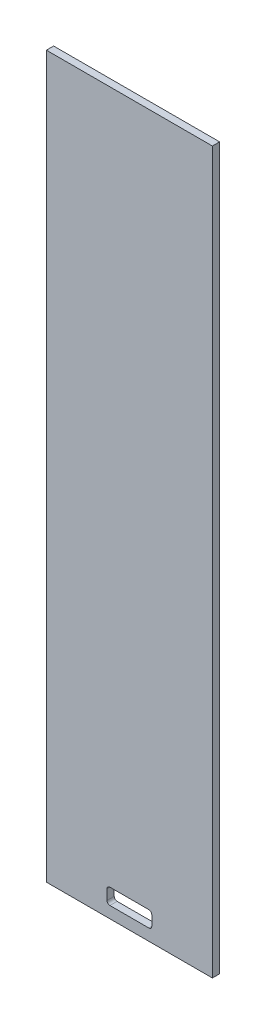
ISO-10303-21;
HEADER;
FILE_DESCRIPTION(('STEP AP214'),'2;1');
FILE_NAME('part.step','',(''),(''),'','','');
FILE_SCHEMA(('AUTOMOTIVE_DESIGN { 1 0 10303 214 1 1 1 1 }'));
ENDSEC;
DATA;
#1=APPLICATION_CONTEXT('core data for automotive mechanical design processes');
#2=APPLICATION_PROTOCOL_DEFINITION('international standard','automotive_design',2000,#1);
#3=PRODUCT_CONTEXT('',#1,'mechanical');
#4=PRODUCT('Part','Part','',(#3));
#5=PRODUCT_RELATED_PRODUCT_CATEGORY('part','',(#4));
#6=PRODUCT_DEFINITION_FORMATION('','',#4);
#7=PRODUCT_DEFINITION_CONTEXT('part definition',#1,'design');
#8=PRODUCT_DEFINITION('design','',#6,#7);
#9=PRODUCT_DEFINITION_SHAPE('','',#8);
#10=(LENGTH_UNIT() NAMED_UNIT(*) SI_UNIT(.MILLI.,.METRE.));
#11=(NAMED_UNIT(*) PLANE_ANGLE_UNIT() SI_UNIT($,.RADIAN.));
#12=(NAMED_UNIT(*) SI_UNIT($,.STERADIAN.) SOLID_ANGLE_UNIT());
#13=UNCERTAINTY_MEASURE_WITH_UNIT(LENGTH_MEASURE(1.E-05),#10,'distance_accuracy_value','');
#14=(GEOMETRIC_REPRESENTATION_CONTEXT(3) GLOBAL_UNCERTAINTY_ASSIGNED_CONTEXT((#13)) GLOBAL_UNIT_ASSIGNED_CONTEXT((#10,
#11,#12)) REPRESENTATION_CONTEXT('',''));
#15=CARTESIAN_POINT('',(0.,0.,0.));
#16=DIRECTION('',(0.,0.,1.));
#17=DIRECTION('',(1.,0.,0.));
#18=AXIS2_PLACEMENT_3D('',#15,#16,#17);
#19=CARTESIAN_POINT('',(-57.5,499.2,5.));
#20=DIRECTION('',(1.,0.,0.));
#21=DIRECTION('',(0.,1.,0.));
#22=AXIS2_PLACEMENT_3D('',#19,#20,#21);
#23=PLANE('',#22);
#24=DIRECTION('',(0.,-1.,0.));
#25=VECTOR('',#24,1.);
#26=CARTESIAN_POINT('',(-57.5,499.2,0.));
#27=LINE('',#26,#25);
#28=CARTESIAN_POINT('',(-57.5,499.2,0.));
#29=VERTEX_POINT('',#28);
#30=CARTESIAN_POINT('',(-57.5000000000001,0.,0.));
#31=VERTEX_POINT('',#30);
#32=EDGE_CURVE('E153',#29,#31,#27,.T.);
#33=ORIENTED_EDGE('',*,*,#32,.T.);
#34=DIRECTION('',(0.,0.,-1.));
#35=VECTOR('',#34,1.);
#36=CARTESIAN_POINT('',(-57.5000000000001,0.,5.));
#37=LINE('',#36,#35);
#38=CARTESIAN_POINT('',(-57.5000000000001,0.,5.));
#39=VERTEX_POINT('',#38);
#40=EDGE_CURVE('E132',#39,#31,#37,.T.);
#41=ORIENTED_EDGE('',*,*,#40,.F.);
#42=DIRECTION('',(0.,-1.,0.));
#43=VECTOR('',#42,1.);
#44=CARTESIAN_POINT('',(-57.5,499.2,5.));
#45=LINE('',#44,#43);
#46=CARTESIAN_POINT('',(-57.5,499.2,5.));
#47=VERTEX_POINT('',#46);
#48=EDGE_CURVE('E140',#47,#39,#45,.T.);
#49=ORIENTED_EDGE('',*,*,#48,.F.);
#50=DIRECTION('',(0.,0.,-1.));
#51=VECTOR('',#50,1.);
#52=CARTESIAN_POINT('',(-57.5,499.2,5.));
#53=LINE('',#52,#51);
#54=EDGE_CURVE('E253',#47,#29,#53,.T.);
#55=ORIENTED_EDGE('',*,*,#54,.T.);
#56=EDGE_LOOP('',(#33,#41,#49,#55));
#57=FACE_BOUND('',#56,.T.);
#58=ADVANCED_FACE('F38',(#57),#23,.F.);
#59=CARTESIAN_POINT('',(-57.5000000000001,0.,5.));
#60=DIRECTION('',(0.,1.,0.));
#61=DIRECTION('',(0.,0.,1.));
#62=AXIS2_PLACEMENT_3D('',#59,#60,#61);
#63=PLANE('',#62);
#64=DIRECTION('',(1.,0.,0.));
#65=VECTOR('',#64,1.);
#66=CARTESIAN_POINT('',(-57.5000000000001,0.,0.));
#67=LINE('',#66,#65);
#68=CARTESIAN_POINT('',(57.5000000000001,0.,0.));
#69=VERTEX_POINT('',#68);
#70=EDGE_CURVE('E256',#31,#69,#67,.T.);
#71=ORIENTED_EDGE('',*,*,#70,.T.);
#72=DIRECTION('',(0.,0.,-1.));
#73=VECTOR('',#72,1.);
#74=CARTESIAN_POINT('',(57.5000000000001,0.,5.));
#75=LINE('',#74,#73);
#76=CARTESIAN_POINT('',(57.5000000000001,0.,5.));
#77=VERTEX_POINT('',#76);
#78=EDGE_CURVE('E135',#77,#69,#75,.T.);
#79=ORIENTED_EDGE('',*,*,#78,.F.);
#80=DIRECTION('',(1.,0.,0.));
#81=VECTOR('',#80,1.);
#82=CARTESIAN_POINT('',(-57.5000000000001,0.,5.));
#83=LINE('',#82,#81);
#84=EDGE_CURVE('E128',#39,#77,#83,.T.);
#85=ORIENTED_EDGE('',*,*,#84,.F.);
#86=ORIENTED_EDGE('',*,*,#40,.T.);
#87=EDGE_LOOP('',(#71,#79,#85,#86));
#88=FACE_BOUND('',#87,.T.);
#89=ADVANCED_FACE('F130',(#88),#63,.F.);
#90=CARTESIAN_POINT('',(57.5,499.2,5.));
#91=DIRECTION('',(-1.,0.,0.));
#92=DIRECTION('',(0.,-1.,0.));
#93=AXIS2_PLACEMENT_3D('',#90,#91,#92);
#94=PLANE('',#93);
#95=DIRECTION('',(0.,1.,0.));
#96=VECTOR('',#95,1.);
#97=CARTESIAN_POINT('',(57.5,499.2,0.));
#98=LINE('',#97,#96);
#99=CARTESIAN_POINT('',(57.5,499.2,0.));
#100=VERTEX_POINT('',#99);
#101=EDGE_CURVE('E259',#69,#100,#98,.T.);
#102=ORIENTED_EDGE('',*,*,#101,.T.);
#103=DIRECTION('',(0.,0.,-1.));
#104=VECTOR('',#103,1.);
#105=CARTESIAN_POINT('',(57.5,499.2,5.));
#106=LINE('',#105,#104);
#107=CARTESIAN_POINT('',(57.5,499.2,5.));
#108=VERTEX_POINT('',#107);
#109=EDGE_CURVE('E161',#108,#100,#106,.T.);
#110=ORIENTED_EDGE('',*,*,#109,.F.);
#111=DIRECTION('',(0.,1.,0.));
#112=VECTOR('',#111,1.);
#113=CARTESIAN_POINT('',(57.5,499.2,5.));
#114=LINE('',#113,#112);
#115=EDGE_CURVE('E139',#77,#108,#114,.T.);
#116=ORIENTED_EDGE('',*,*,#115,.F.);
#117=ORIENTED_EDGE('',*,*,#78,.T.);
#118=EDGE_LOOP('',(#102,#110,#116,#117));
#119=FACE_BOUND('',#118,.T.);
#120=ADVANCED_FACE('F273',(#119),#94,.F.);
#121=CARTESIAN_POINT('',(-57.5,499.2,5.));
#122=DIRECTION('',(0.,-1.,0.));
#123=DIRECTION('',(0.,0.,-1.));
#124=AXIS2_PLACEMENT_3D('',#121,#122,#123);
#125=PLANE('',#124);
#126=DIRECTION('',(-1.,0.,0.));
#127=VECTOR('',#126,1.);
#128=CARTESIAN_POINT('',(-57.5,499.2,0.));
#129=LINE('',#128,#127);
#130=EDGE_CURVE('E150',#100,#29,#129,.T.);
#131=ORIENTED_EDGE('',*,*,#130,.T.);
#132=ORIENTED_EDGE('',*,*,#54,.F.);
#133=DIRECTION('',(-1.,0.,0.));
#134=VECTOR('',#133,1.);
#135=CARTESIAN_POINT('',(-57.5,499.2,5.));
#136=LINE('',#135,#134);
#137=EDGE_CURVE('E145',#108,#47,#136,.T.);
#138=ORIENTED_EDGE('',*,*,#137,.F.);
#139=ORIENTED_EDGE('',*,*,#109,.T.);
#140=EDGE_LOOP('',(#131,#132,#138,#139));
#141=FACE_BOUND('',#140,.T.);
#142=ADVANCED_FACE('F270',(#141),#125,.F.);
#143=CARTESIAN_POINT('',(0.,0.,5.));
#144=DIRECTION('',(0.,0.,1.));
#145=DIRECTION('',(1.,0.,0.));
#146=AXIS2_PLACEMENT_3D('',#143,#144,#145);
#147=PLANE('',#146);
#148=DIRECTION('',(0.,-1.,0.));
#149=VECTOR('',#148,1.);
#150=CARTESIAN_POINT('',(-15.5,19.,5.));
#151=LINE('',#150,#149);
#152=CARTESIAN_POINT('',(-15.5,17.,5.));
#153=VERTEX_POINT('',#152);
#154=CARTESIAN_POINT('',(-15.5,10.,5.));
#155=VERTEX_POINT('',#154);
#156=EDGE_CURVE('E208',#153,#155,#151,.T.);
#157=ORIENTED_EDGE('',*,*,#156,.F.);
#158=CARTESIAN_POINT('',(-13.5,17.,5.));
#159=DIRECTION('',(0.,0.,1.));
#160=DIRECTION('',(1.,0.,0.));
#161=AXIS2_PLACEMENT_3D('',#158,#159,#160);
#162=CIRCLE('',#161,2.);
#163=CARTESIAN_POINT('',(-13.5,19.,5.));
#164=VERTEX_POINT('',#163);
#165=EDGE_CURVE('E47',#153,#164,#162,.F.);
#166=ORIENTED_EDGE('',*,*,#165,.T.);
#167=DIRECTION('',(-1.,0.,0.));
#168=VECTOR('',#167,1.);
#169=CARTESIAN_POINT('',(-15.5,19.,5.));
#170=LINE('',#169,#168);
#171=CARTESIAN_POINT('',(13.5,19.,5.));
#172=VERTEX_POINT('',#171);
#173=EDGE_CURVE('E207',#172,#164,#170,.T.);
#174=ORIENTED_EDGE('',*,*,#173,.F.);
#175=CARTESIAN_POINT('',(13.5,17.,5.));
#176=DIRECTION('',(0.,0.,1.));
#177=DIRECTION('',(1.,0.,0.));
#178=AXIS2_PLACEMENT_3D('',#175,#176,#177);
#179=CIRCLE('',#178,2.);
#180=CARTESIAN_POINT('',(15.5,17.,5.));
#181=VERTEX_POINT('',#180);
#182=EDGE_CURVE('E194',#172,#181,#179,.F.);
#183=ORIENTED_EDGE('',*,*,#182,.T.);
#184=DIRECTION('',(0.,1.,0.));
#185=VECTOR('',#184,1.);
#186=CARTESIAN_POINT('',(15.5,19.,5.));
#187=LINE('',#186,#185);
#188=CARTESIAN_POINT('',(15.5,10.,5.));
#189=VERTEX_POINT('',#188);
#190=EDGE_CURVE('E216',#189,#181,#187,.T.);
#191=ORIENTED_EDGE('',*,*,#190,.F.);
#192=CARTESIAN_POINT('',(13.5,10.,5.));
#193=DIRECTION('',(0.,0.,1.));
#194=DIRECTION('',(1.,0.,0.));
#195=AXIS2_PLACEMENT_3D('',#192,#193,#194);
#196=CIRCLE('',#195,2.);
#197=CARTESIAN_POINT('',(13.5,8.,5.));
#198=VERTEX_POINT('',#197);
#199=EDGE_CURVE('E188',#189,#198,#196,.F.);
#200=ORIENTED_EDGE('',*,*,#199,.T.);
#201=DIRECTION('',(1.,0.,0.));
#202=VECTOR('',#201,1.);
#203=CARTESIAN_POINT('',(-15.5,8.,5.));
#204=LINE('',#203,#202);
#205=CARTESIAN_POINT('',(-13.5,8.,5.));
#206=VERTEX_POINT('',#205);
#207=EDGE_CURVE('E234',#206,#198,#204,.T.);
#208=ORIENTED_EDGE('',*,*,#207,.F.);
#209=CARTESIAN_POINT('',(-13.5,10.,5.));
#210=DIRECTION('',(0.,0.,1.));
#211=DIRECTION('',(1.,0.,0.));
#212=AXIS2_PLACEMENT_3D('',#209,#210,#211);
#213=CIRCLE('',#212,2.);
#214=EDGE_CURVE('E54',#206,#155,#213,.F.);
#215=ORIENTED_EDGE('',*,*,#214,.T.);
#216=EDGE_LOOP('',(#157,#166,#174,#183,#191,#200,#208,#215));
#217=FACE_BOUND('',#216,.T.);
#218=ORIENTED_EDGE('',*,*,#48,.T.);
#219=ORIENTED_EDGE('',*,*,#84,.T.);
#220=ORIENTED_EDGE('',*,*,#115,.T.);
#221=ORIENTED_EDGE('',*,*,#137,.T.);
#222=EDGE_LOOP('',(#218,#219,#220,#221));
#223=FACE_BOUND('',#222,.T.);
#224=ADVANCED_FACE('F143',(#217,#223),#147,.T.);
#225=CARTESIAN_POINT('',(0.,0.,0.));
#226=DIRECTION('',(0.,0.,1.));
#227=DIRECTION('',(1.,0.,0.));
#228=AXIS2_PLACEMENT_3D('',#225,#226,#227);
#229=PLANE('',#228);
#230=DIRECTION('',(1.,0.,0.));
#231=VECTOR('',#230,1.);
#232=CARTESIAN_POINT('',(-15.5,19.,0.));
#233=LINE('',#232,#231);
#234=CARTESIAN_POINT('',(-13.5,19.,0.));
#235=VERTEX_POINT('',#234);
#236=CARTESIAN_POINT('',(13.5,19.,0.));
#237=VERTEX_POINT('',#236);
#238=EDGE_CURVE('E226',#235,#237,#233,.T.);
#239=ORIENTED_EDGE('',*,*,#238,.F.);
#240=CARTESIAN_POINT('',(-13.5,17.,0.));
#241=DIRECTION('',(0.,0.,1.));
#242=DIRECTION('',(1.,0.,0.));
#243=AXIS2_PLACEMENT_3D('',#240,#241,#242);
#244=CIRCLE('',#243,2.);
#245=CARTESIAN_POINT('',(-15.5,17.,0.));
#246=VERTEX_POINT('',#245);
#247=EDGE_CURVE('E11',#235,#246,#244,.T.);
#248=ORIENTED_EDGE('',*,*,#247,.T.);
#249=DIRECTION('',(0.,1.,0.));
#250=VECTOR('',#249,1.);
#251=CARTESIAN_POINT('',(-15.5,19.,0.));
#252=LINE('',#251,#250);
#253=CARTESIAN_POINT('',(-15.5,10.,0.));
#254=VERTEX_POINT('',#253);
#255=EDGE_CURVE('E224',#254,#246,#252,.T.);
#256=ORIENTED_EDGE('',*,*,#255,.F.);
#257=CARTESIAN_POINT('',(-13.5,10.,0.));
#258=DIRECTION('',(0.,0.,1.));
#259=DIRECTION('',(1.,0.,0.));
#260=AXIS2_PLACEMENT_3D('',#257,#258,#259);
#261=CIRCLE('',#260,2.);
#262=CARTESIAN_POINT('',(-13.5,8.,0.));
#263=VERTEX_POINT('',#262);
#264=EDGE_CURVE('E202',#254,#263,#261,.T.);
#265=ORIENTED_EDGE('',*,*,#264,.T.);
#266=DIRECTION('',(-1.,0.,0.));
#267=VECTOR('',#266,1.);
#268=CARTESIAN_POINT('',(-15.5,8.,0.));
#269=LINE('',#268,#267);
#270=CARTESIAN_POINT('',(13.5,8.,0.));
#271=VERTEX_POINT('',#270);
#272=EDGE_CURVE('E215',#271,#263,#269,.T.);
#273=ORIENTED_EDGE('',*,*,#272,.F.);
#274=CARTESIAN_POINT('',(13.5,10.,0.));
#275=DIRECTION('',(0.,0.,1.));
#276=DIRECTION('',(1.,0.,0.));
#277=AXIS2_PLACEMENT_3D('',#274,#275,#276);
#278=CIRCLE('',#277,2.);
#279=CARTESIAN_POINT('',(15.5,10.,0.));
#280=VERTEX_POINT('',#279);
#281=EDGE_CURVE('E191',#271,#280,#278,.T.);
#282=ORIENTED_EDGE('',*,*,#281,.T.);
#283=DIRECTION('',(0.,-1.,0.));
#284=VECTOR('',#283,1.);
#285=CARTESIAN_POINT('',(15.5,19.,0.));
#286=LINE('',#285,#284);
#287=CARTESIAN_POINT('',(15.5,17.,0.));
#288=VERTEX_POINT('',#287);
#289=EDGE_CURVE('E236',#288,#280,#286,.T.);
#290=ORIENTED_EDGE('',*,*,#289,.F.);
#291=CARTESIAN_POINT('',(13.5,17.,0.));
#292=DIRECTION('',(0.,0.,1.));
#293=DIRECTION('',(1.,0.,0.));
#294=AXIS2_PLACEMENT_3D('',#291,#292,#293);
#295=CIRCLE('',#294,2.);
#296=EDGE_CURVE('E197',#288,#237,#295,.T.);
#297=ORIENTED_EDGE('',*,*,#296,.T.);
#298=EDGE_LOOP('',(#239,#248,#256,#265,#273,#282,#290,#297));
#299=FACE_BOUND('',#298,.T.);
#300=ORIENTED_EDGE('',*,*,#32,.F.);
#301=ORIENTED_EDGE('',*,*,#130,.F.);
#302=ORIENTED_EDGE('',*,*,#101,.F.);
#303=ORIENTED_EDGE('',*,*,#70,.F.);
#304=EDGE_LOOP('',(#300,#301,#302,#303));
#305=FACE_BOUND('',#304,.T.);
#306=ADVANCED_FACE('F222',(#299,#305),#229,.F.);
#307=CARTESIAN_POINT('',(-15.5,19.,-0.00100000000000013));
#308=DIRECTION('',(-1.,0.,0.));
#309=DIRECTION('',(0.,-1.,0.));
#310=AXIS2_PLACEMENT_3D('',#307,#308,#309);
#311=PLANE('',#310);
#312=ORIENTED_EDGE('',*,*,#156,.T.);
#313=DIRECTION('',(0.,0.,1.));
#314=VECTOR('',#313,1.);
#315=CARTESIAN_POINT('',(-15.5,10.,0.));
#316=LINE('',#315,#314);
#317=EDGE_CURVE('E185',#155,#254,#316,.F.);
#318=ORIENTED_EDGE('',*,*,#317,.T.);
#319=ORIENTED_EDGE('',*,*,#255,.T.);
#320=DIRECTION('',(0.,0.,1.));
#321=VECTOR('',#320,1.);
#322=CARTESIAN_POINT('',(-15.5,17.,5.));
#323=LINE('',#322,#321);
#324=EDGE_CURVE('E182',#246,#153,#323,.T.);
#325=ORIENTED_EDGE('',*,*,#324,.T.);
#326=EDGE_LOOP('',(#312,#318,#319,#325));
#327=FACE_BOUND('',#326,.T.);
#328=ADVANCED_FACE('F228',(#327),#311,.F.);
#329=CARTESIAN_POINT('',(-15.5,19.,-0.00100000000000013));
#330=DIRECTION('',(0.,1.,0.));
#331=DIRECTION('',(0.,0.,1.));
#332=AXIS2_PLACEMENT_3D('',#329,#330,#331);
#333=PLANE('',#332);
#334=ORIENTED_EDGE('',*,*,#238,.T.);
#335=DIRECTION('',(0.,0.,1.));
#336=VECTOR('',#335,1.);
#337=CARTESIAN_POINT('',(13.5,19.,5.));
#338=LINE('',#337,#336);
#339=EDGE_CURVE('E178',#237,#172,#338,.T.);
#340=ORIENTED_EDGE('',*,*,#339,.T.);
#341=ORIENTED_EDGE('',*,*,#173,.T.);
#342=DIRECTION('',(0.,0.,1.));
#343=VECTOR('',#342,1.);
#344=CARTESIAN_POINT('',(-13.5,19.,0.));
#345=LINE('',#344,#343);
#346=EDGE_CURVE('E175',#164,#235,#345,.F.);
#347=ORIENTED_EDGE('',*,*,#346,.T.);
#348=EDGE_LOOP('',(#334,#340,#341,#347));
#349=FACE_BOUND('',#348,.T.);
#350=ADVANCED_FACE('F211',(#349),#333,.F.);
#351=CARTESIAN_POINT('',(15.5,19.,-0.00100000000000013));
#352=DIRECTION('',(1.,0.,0.));
#353=DIRECTION('',(0.,1.,0.));
#354=AXIS2_PLACEMENT_3D('',#351,#352,#353);
#355=PLANE('',#354);
#356=ORIENTED_EDGE('',*,*,#289,.T.);
#357=DIRECTION('',(0.,0.,1.));
#358=VECTOR('',#357,1.);
#359=CARTESIAN_POINT('',(15.5,10.,5.));
#360=LINE('',#359,#358);
#361=EDGE_CURVE('E159',#280,#189,#360,.T.);
#362=ORIENTED_EDGE('',*,*,#361,.T.);
#363=ORIENTED_EDGE('',*,*,#190,.T.);
#364=DIRECTION('',(0.,0.,1.));
#365=VECTOR('',#364,1.);
#366=CARTESIAN_POINT('',(15.5,17.,0.));
#367=LINE('',#366,#365);
#368=EDGE_CURVE('E155',#181,#288,#367,.F.);
#369=ORIENTED_EDGE('',*,*,#368,.T.);
#370=EDGE_LOOP('',(#356,#362,#363,#369));
#371=FACE_BOUND('',#370,.T.);
#372=ADVANCED_FACE('F311',(#371),#355,.F.);
#373=CARTESIAN_POINT('',(-15.5,8.,-0.00100000000000013));
#374=DIRECTION('',(0.,-1.,0.));
#375=DIRECTION('',(0.,0.,-1.));
#376=AXIS2_PLACEMENT_3D('',#373,#374,#375);
#377=PLANE('',#376);
#378=ORIENTED_EDGE('',*,*,#207,.T.);
#379=DIRECTION('',(0.,0.,1.));
#380=VECTOR('',#379,1.);
#381=CARTESIAN_POINT('',(13.5,8.,0.));
#382=LINE('',#381,#380);
#383=EDGE_CURVE('E172',#198,#271,#382,.F.);
#384=ORIENTED_EDGE('',*,*,#383,.T.);
#385=ORIENTED_EDGE('',*,*,#272,.T.);
#386=DIRECTION('',(0.,0.,1.));
#387=VECTOR('',#386,1.);
#388=CARTESIAN_POINT('',(-13.5,8.,5.));
#389=LINE('',#388,#387);
#390=EDGE_CURVE('E168',#263,#206,#389,.T.);
#391=ORIENTED_EDGE('',*,*,#390,.T.);
#392=EDGE_LOOP('',(#378,#384,#385,#391));
#393=FACE_BOUND('',#392,.T.);
#394=ADVANCED_FACE('F291',(#393),#377,.F.);
#395=CARTESIAN_POINT('',(13.5,10.,-0.00100000000000013));
#396=DIRECTION('',(0.,0.,-1.));
#397=DIRECTION('',(-1.,0.,0.));
#398=AXIS2_PLACEMENT_3D('',#395,#396,#397);
#399=CYLINDRICAL_SURFACE('',#398,2.);
#400=ORIENTED_EDGE('',*,*,#281,.F.);
#401=ORIENTED_EDGE('',*,*,#383,.F.);
#402=ORIENTED_EDGE('',*,*,#199,.F.);
#403=ORIENTED_EDGE('',*,*,#361,.F.);
#404=EDGE_LOOP('',(#400,#401,#402,#403));
#405=FACE_BOUND('',#404,.T.);
#406=ADVANCED_FACE('F287',(#405),#399,.F.);
#407=CARTESIAN_POINT('',(13.5,17.,-0.00100000000000013));
#408=DIRECTION('',(0.,0.,-1.));
#409=DIRECTION('',(-1.,0.,0.));
#410=AXIS2_PLACEMENT_3D('',#407,#408,#409);
#411=CYLINDRICAL_SURFACE('',#410,2.);
#412=ORIENTED_EDGE('',*,*,#296,.F.);
#413=ORIENTED_EDGE('',*,*,#368,.F.);
#414=ORIENTED_EDGE('',*,*,#182,.F.);
#415=ORIENTED_EDGE('',*,*,#339,.F.);
#416=EDGE_LOOP('',(#412,#413,#414,#415));
#417=FACE_BOUND('',#416,.T.);
#418=ADVANCED_FACE('F290',(#417),#411,.F.);
#419=CARTESIAN_POINT('',(-13.5,10.,-0.00100000000000013));
#420=DIRECTION('',(0.,0.,-1.));
#421=DIRECTION('',(-1.,0.,0.));
#422=AXIS2_PLACEMENT_3D('',#419,#420,#421);
#423=CYLINDRICAL_SURFACE('',#422,2.);
#424=ORIENTED_EDGE('',*,*,#264,.F.);
#425=ORIENTED_EDGE('',*,*,#317,.F.);
#426=ORIENTED_EDGE('',*,*,#214,.F.);
#427=ORIENTED_EDGE('',*,*,#390,.F.);
#428=EDGE_LOOP('',(#424,#425,#426,#427));
#429=FACE_BOUND('',#428,.T.);
#430=ADVANCED_FACE('F294',(#429),#423,.F.);
#431=CARTESIAN_POINT('',(-13.5,17.,-0.00100000000000013));
#432=DIRECTION('',(0.,0.,-1.));
#433=DIRECTION('',(-1.,0.,0.));
#434=AXIS2_PLACEMENT_3D('',#431,#432,#433);
#435=CYLINDRICAL_SURFACE('',#434,2.);
#436=ORIENTED_EDGE('',*,*,#247,.F.);
#437=ORIENTED_EDGE('',*,*,#346,.F.);
#438=ORIENTED_EDGE('',*,*,#165,.F.);
#439=ORIENTED_EDGE('',*,*,#324,.F.);
#440=EDGE_LOOP('',(#436,#437,#438,#439));
#441=FACE_BOUND('',#440,.T.);
#442=ADVANCED_FACE('F40',(#441),#435,.F.);
#443=CLOSED_SHELL('',(#58,#89,#120,#142,#224,#306,#328,#350,#372,#394,#406,#418,#430,#442));
#444=MANIFOLD_SOLID_BREP('B2',#443);
#445=ADVANCED_BREP_SHAPE_REPRESENTATION('',(#18,#444),#14);
#446=SHAPE_DEFINITION_REPRESENTATION(#9,#445);
ENDSEC;
END-ISO-10303-21;
